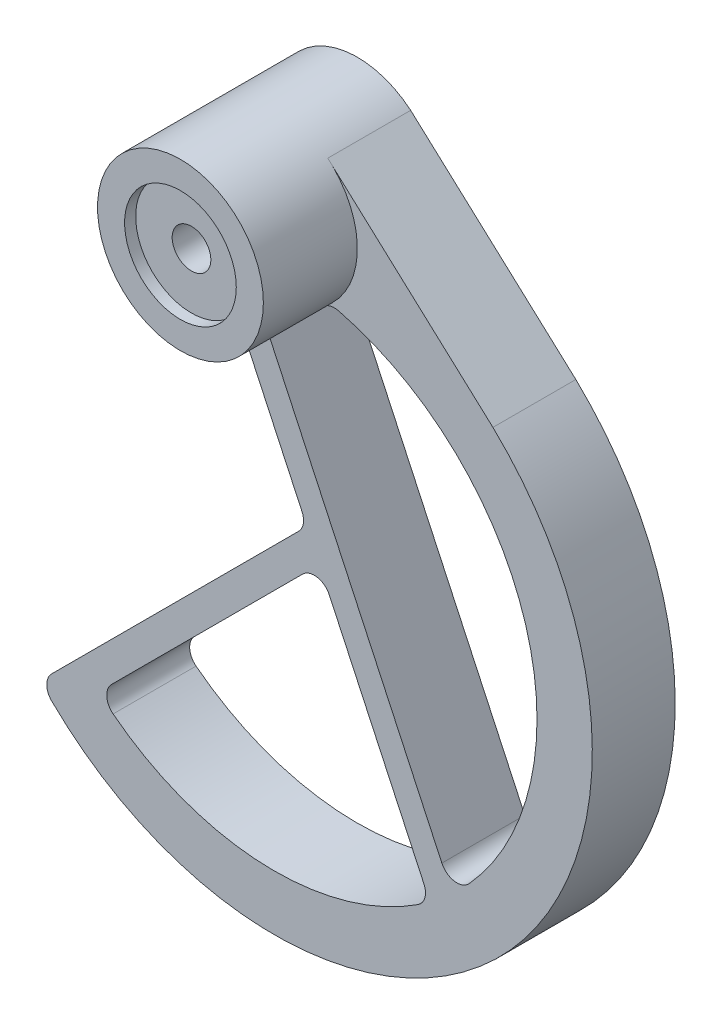
ISO-10303-21;
HEADER;
FILE_DESCRIPTION(('STEP AP214'),'2;1');
FILE_NAME('part.step','',(''),(''),'','','');
FILE_SCHEMA(('AUTOMOTIVE_DESIGN { 1 0 10303 214 1 1 1 1 }'));
ENDSEC;
DATA;
#1=APPLICATION_CONTEXT('core data for automotive mechanical design processes');
#2=APPLICATION_PROTOCOL_DEFINITION('international standard','automotive_design',2000,#1);
#3=PRODUCT_CONTEXT('',#1,'mechanical');
#4=PRODUCT('Part','Part','',(#3));
#5=PRODUCT_RELATED_PRODUCT_CATEGORY('part','',(#4));
#6=PRODUCT_DEFINITION_FORMATION('','',#4);
#7=PRODUCT_DEFINITION_CONTEXT('part definition',#1,'design');
#8=PRODUCT_DEFINITION('design','',#6,#7);
#9=PRODUCT_DEFINITION_SHAPE('','',#8);
#10=(LENGTH_UNIT() NAMED_UNIT(*) SI_UNIT(.MILLI.,.METRE.));
#11=(NAMED_UNIT(*) PLANE_ANGLE_UNIT() SI_UNIT($,.RADIAN.));
#12=(NAMED_UNIT(*) SI_UNIT($,.STERADIAN.) SOLID_ANGLE_UNIT());
#13=UNCERTAINTY_MEASURE_WITH_UNIT(LENGTH_MEASURE(1.E-05),#10,'distance_accuracy_value','');
#14=(GEOMETRIC_REPRESENTATION_CONTEXT(3) GLOBAL_UNCERTAINTY_ASSIGNED_CONTEXT((#13)) GLOBAL_UNIT_ASSIGNED_CONTEXT((#10,
#11,#12)) REPRESENTATION_CONTEXT('',''));
#15=CARTESIAN_POINT('',(0.,0.,0.));
#16=DIRECTION('',(0.,0.,1.));
#17=DIRECTION('',(1.,0.,0.));
#18=AXIS2_PLACEMENT_3D('',#15,#16,#17);
#19=CARTESIAN_POINT('',(0.,57.5,0.));
#20=DIRECTION('',(0.,0.,1.));
#21=DIRECTION('',(1.,0.,0.));
#22=AXIS2_PLACEMENT_3D('',#19,#20,#21);
#23=CYLINDRICAL_SURFACE('',#22,3.5);
#24=CARTESIAN_POINT('',(0.,57.5,0.));
#25=DIRECTION('',(0.,0.,1.));
#26=DIRECTION('',(1.,0.,0.));
#27=AXIS2_PLACEMENT_3D('',#24,#25,#26);
#28=CIRCLE('',#27,3.5);
#29=CARTESIAN_POINT('',(3.5,57.5,0.));
#30=VERTEX_POINT('',#29);
#31=EDGE_CURVE('E253',#30,#30,#28,.T.);
#32=ORIENTED_EDGE('',*,*,#31,.F.);
#33=EDGE_LOOP('',(#32));
#34=FACE_BOUND('',#33,.T.);
#35=CARTESIAN_POINT('',(0.,57.5,30.));
#36=DIRECTION('',(0.,0.,1.));
#37=DIRECTION('',(1.,0.,0.));
#38=AXIS2_PLACEMENT_3D('',#35,#36,#37);
#39=CIRCLE('',#38,3.5);
#40=CARTESIAN_POINT('',(3.5,57.5,30.));
#41=VERTEX_POINT('',#40);
#42=EDGE_CURVE('E37',#41,#41,#39,.F.);
#43=ORIENTED_EDGE('',*,*,#42,.F.);
#44=EDGE_LOOP('',(#43));
#45=FACE_BOUND('',#44,.T.);
#46=ADVANCED_FACE('F33',(#34,#45),#23,.F.);
#47=CARTESIAN_POINT('',(8.4291609341208,3.93058229540153,15.));
#48=DIRECTION('',(0.906307787036647,0.422618261740705,0.));
#49=DIRECTION('',(-0.422618261740705,0.906307787036647,0.));
#50=AXIS2_PLACEMENT_3D('',#47,#48,#49);
#51=PLANE('',#50);
#52=DIRECTION('',(0.422618261740705,-0.906307787036647,0.));
#53=VECTOR('',#52,1.);
#54=CARTESIAN_POINT('',(8.4291609341208,3.93058229540153,0.));
#55=LINE('',#54,#53);
#56=CARTESIAN_POINT('',(-13.5946168055502,51.1607260738895,0.));
#57=VERTEX_POINT('',#56);
#58=CARTESIAN_POINT('',(4.98643209632603,11.3135381134901,0.));
#59=VERTEX_POINT('',#58);
#60=EDGE_CURVE('E346',#57,#59,#55,.T.);
#61=ORIENTED_EDGE('',*,*,#60,.T.);
#62=DIRECTION('',(0.,0.,-1.));
#63=VECTOR('',#62,1.);
#64=CARTESIAN_POINT('',(4.98643209632603,11.3135381134901,15.));
#65=LINE('',#64,#63);
#66=CARTESIAN_POINT('',(4.98643209632603,11.3135381134901,15.));
#67=VERTEX_POINT('',#66);
#68=EDGE_CURVE('E213',#67,#59,#65,.T.);
#69=ORIENTED_EDGE('',*,*,#68,.F.);
#70=DIRECTION('',(0.422618261740705,-0.906307787036647,0.));
#71=VECTOR('',#70,1.);
#72=CARTESIAN_POINT('',(8.4291609341208,3.93058229540153,15.));
#73=LINE('',#72,#71);
#74=CARTESIAN_POINT('',(-13.5946168055502,51.1607260738895,15.));
#75=VERTEX_POINT('',#74);
#76=EDGE_CURVE('E283',#75,#67,#73,.T.);
#77=ORIENTED_EDGE('',*,*,#76,.F.);
#78=DIRECTION('',(0.,0.,-1.));
#79=VECTOR('',#78,1.);
#80=CARTESIAN_POINT('',(-13.5946168055502,51.1607260738895,15.));
#81=LINE('',#80,#79);
#82=EDGE_CURVE('E203',#75,#57,#81,.T.);
#83=ORIENTED_EDGE('',*,*,#82,.T.);
#84=EDGE_LOOP('',(#61,#69,#77,#83));
#85=FACE_BOUND('',#84,.T.);
#86=ADVANCED_FACE('F323',(#85),#51,.F.);
#87=CARTESIAN_POINT('',(2.26750873521609,10.045683328268,15.));
#88=DIRECTION('',(0.,0.,-1.));
#89=DIRECTION('',(-1.,0.,0.));
#90=AXIS2_PLACEMENT_3D('',#87,#88,#89);
#91=CYLINDRICAL_SURFACE('',#90,3.);
#92=CARTESIAN_POINT('',(2.26750873521609,10.045683328268,0.));
#93=DIRECTION('',(0.,0.,1.));
#94=DIRECTION('',(1.,0.,0.));
#95=AXIS2_PLACEMENT_3D('',#92,#93,#94);
#96=CIRCLE('',#95,3.);
#97=CARTESIAN_POINT('',(4.38882907877573,7.92436298470834,0.));
#98=VERTEX_POINT('',#97);
#99=EDGE_CURVE('E329',#59,#98,#96,.F.);
#100=ORIENTED_EDGE('',*,*,#99,.T.);
#101=DIRECTION('',(0.,0.,-1.));
#102=VECTOR('',#101,1.);
#103=CARTESIAN_POINT('',(4.38882907877573,7.92436298470834,15.));
#104=LINE('',#103,#102);
#105=CARTESIAN_POINT('',(4.38882907877573,7.92436298470834,15.));
#106=VERTEX_POINT('',#105);
#107=EDGE_CURVE('E210',#106,#98,#104,.T.);
#108=ORIENTED_EDGE('',*,*,#107,.F.);
#109=CARTESIAN_POINT('',(2.26750873521609,10.045683328268,15.));
#110=DIRECTION('',(0.,0.,1.));
#111=DIRECTION('',(1.,0.,0.));
#112=AXIS2_PLACEMENT_3D('',#109,#110,#111);
#113=CIRCLE('',#112,3.);
#114=EDGE_CURVE('E284',#67,#106,#113,.F.);
#115=ORIENTED_EDGE('',*,*,#114,.F.);
#116=ORIENTED_EDGE('',*,*,#68,.T.);
#117=EDGE_LOOP('',(#100,#108,#115,#116));
#118=FACE_BOUND('',#117,.T.);
#119=ADVANCED_FACE('F328',(#118),#91,.F.);
#120=CARTESIAN_POINT('',(-1.7677669529663,1.76776695296629,15.));
#121=DIRECTION('',(0.707106781186549,-0.707106781186546,0.));
#122=DIRECTION('',(0.707106781186546,0.707106781186549,0.));
#123=AXIS2_PLACEMENT_3D('',#120,#121,#122);
#124=PLANE('',#123);
#125=DIRECTION('',(-0.707106781186546,-0.707106781186549,0.));
#126=VECTOR('',#125,1.);
#127=CARTESIAN_POINT('',(-1.7677669529663,1.76776695296629,0.));
#128=LINE('',#127,#126);
#129=CARTESIAN_POINT('',(-40.3034646889616,-36.7679307830292,0.));
#130=VERTEX_POINT('',#129);
#131=EDGE_CURVE('E333',#98,#130,#128,.T.);
#132=ORIENTED_EDGE('',*,*,#131,.T.);
#133=DIRECTION('',(0.,0.,-1.));
#134=VECTOR('',#133,1.);
#135=CARTESIAN_POINT('',(-40.3034646889616,-36.7679307830292,15.));
#136=LINE('',#135,#134);
#137=CARTESIAN_POINT('',(-40.3034646889616,-36.7679307830292,15.));
#138=VERTEX_POINT('',#137);
#139=EDGE_CURVE('E201',#138,#130,#136,.T.);
#140=ORIENTED_EDGE('',*,*,#139,.F.);
#141=DIRECTION('',(-0.707106781186546,-0.707106781186549,0.));
#142=VECTOR('',#141,1.);
#143=CARTESIAN_POINT('',(-1.7677669529663,1.76776695296629,15.));
#144=LINE('',#143,#142);
#145=EDGE_CURVE('E286',#106,#138,#144,.T.);
#146=ORIENTED_EDGE('',*,*,#145,.F.);
#147=ORIENTED_EDGE('',*,*,#107,.T.);
#148=EDGE_LOOP('',(#132,#140,#146,#147));
#149=FACE_BOUND('',#148,.T.);
#150=ADVANCED_FACE('F332',(#149),#124,.F.);
#151=CARTESIAN_POINT('',(-38.1821443454019,-38.8892511265888,15.));
#152=DIRECTION('',(0.,0.,-1.));
#153=DIRECTION('',(-1.,0.,0.));
#154=AXIS2_PLACEMENT_3D('',#151,#152,#153);
#155=CYLINDRICAL_SURFACE('',#154,3.00000000000001);
#156=CARTESIAN_POINT('',(-38.1821443454019,-38.8892511265888,0.));
#157=DIRECTION('',(0.,0.,1.));
#158=DIRECTION('',(1.,0.,0.));
#159=AXIS2_PLACEMENT_3D('',#156,#157,#158);
#160=CIRCLE('',#159,3.00000000000001);
#161=CARTESIAN_POINT('',(-40.2839137589103,-41.0299438491533,0.));
#162=VERTEX_POINT('',#161);
#163=EDGE_CURVE('E337',#130,#162,#160,.T.);
#164=ORIENTED_EDGE('',*,*,#163,.T.);
#165=DIRECTION('',(0.,0.,-1.));
#166=VECTOR('',#165,1.);
#167=CARTESIAN_POINT('',(-40.2839137589103,-41.0299438491533,15.));
#168=LINE('',#167,#166);
#169=CARTESIAN_POINT('',(-40.2839137589103,-41.0299438491533,15.));
#170=VERTEX_POINT('',#169);
#171=EDGE_CURVE('E199',#170,#162,#168,.T.);
#172=ORIENTED_EDGE('',*,*,#171,.F.);
#173=CARTESIAN_POINT('',(-38.1821443454019,-38.8892511265888,15.));
#174=DIRECTION('',(0.,0.,1.));
#175=DIRECTION('',(1.,0.,0.));
#176=AXIS2_PLACEMENT_3D('',#173,#174,#175);
#177=CIRCLE('',#176,3.00000000000001);
#178=EDGE_CURVE('E190',#138,#170,#177,.T.);
#179=ORIENTED_EDGE('',*,*,#178,.F.);
#180=ORIENTED_EDGE('',*,*,#139,.T.);
#181=EDGE_LOOP('',(#164,#172,#179,#180));
#182=FACE_BOUND('',#181,.T.);
#183=ADVANCED_FACE('F336',(#182),#155,.T.);
#184=CARTESIAN_POINT('',(0.,0.,15.));
#185=DIRECTION('',(0.,0.,-1.));
#186=DIRECTION('',(-1.,0.,0.));
#187=AXIS2_PLACEMENT_3D('',#184,#185,#186);
#188=CYLINDRICAL_SURFACE('',#187,57.5);
#189=CARTESIAN_POINT('',(0.,0.,0.));
#190=DIRECTION('',(0.,0.,1.));
#191=DIRECTION('',(1.,0.,0.));
#192=AXIS2_PLACEMENT_3D('',#189,#190,#191);
#193=CIRCLE('',#192,57.5);
#194=CARTESIAN_POINT('',(39.5241066523143,41.7623633590879,0.));
#195=VERTEX_POINT('',#194);
#196=EDGE_CURVE('E197',#162,#195,#193,.T.);
#197=ORIENTED_EDGE('',*,*,#196,.T.);
#198=DIRECTION('',(0.,0.,-1.));
#199=VECTOR('',#198,1.);
#200=CARTESIAN_POINT('',(39.5241066523143,41.7623633590879,15.));
#201=LINE('',#200,#199);
#202=CARTESIAN_POINT('',(39.5241066523143,41.7623633590879,15.));
#203=VERTEX_POINT('',#202);
#204=EDGE_CURVE('E179',#203,#195,#201,.T.);
#205=ORIENTED_EDGE('',*,*,#204,.F.);
#206=CARTESIAN_POINT('',(0.,0.,15.));
#207=DIRECTION('',(0.,0.,1.));
#208=DIRECTION('',(1.,0.,0.));
#209=AXIS2_PLACEMENT_3D('',#206,#207,#208);
#210=CIRCLE('',#209,57.5);
#211=EDGE_CURVE('E184',#170,#203,#210,.T.);
#212=ORIENTED_EDGE('',*,*,#211,.F.);
#213=ORIENTED_EDGE('',*,*,#171,.T.);
#214=EDGE_LOOP('',(#197,#205,#212,#213));
#215=FACE_BOUND('',#214,.T.);
#216=ADVANCED_FACE('F195',(#215),#188,.T.);
#217=CARTESIAN_POINT('',(38.7204724221989,42.4946229922743,15.));
#218=DIRECTION('',(0.673519927701708,0.739169065227087,0.));
#219=DIRECTION('',(-0.739169065227087,0.673519927701708,0.));
#220=AXIS2_PLACEMENT_3D('',#217,#218,#219);
#221=PLANE('',#220);
#222=DIRECTION('',(0.739169065227087,-0.673519927701708,0.));
#223=VECTOR('',#222,1.);
#224=CARTESIAN_POINT('',(38.7204724221989,42.4946229922743,0.));
#225=LINE('',#224,#223);
#226=CARTESIAN_POINT('',(9.64181414529832,68.990666646785,0.));
#227=VERTEX_POINT('',#226);
#228=EDGE_CURVE('E340',#227,#195,#225,.T.);
#229=ORIENTED_EDGE('',*,*,#228,.F.);
#230=DIRECTION('',(0.,0.,-1.));
#231=VECTOR('',#230,1.);
#232=CARTESIAN_POINT('',(9.64181414529832,68.990666646785,15.));
#233=LINE('',#232,#231);
#234=CARTESIAN_POINT('',(9.64181414529832,68.990666646785,15.));
#235=VERTEX_POINT('',#234);
#236=EDGE_CURVE('E113',#235,#227,#233,.T.);
#237=ORIENTED_EDGE('',*,*,#236,.F.);
#238=DIRECTION('',(0.739169065227087,-0.673519927701708,0.));
#239=VECTOR('',#238,1.);
#240=CARTESIAN_POINT('',(38.7204724221989,42.4946229922743,15.));
#241=LINE('',#240,#239);
#242=CARTESIAN_POINT('',(10.5469447314245,68.1659250340648,15.));
#243=VERTEX_POINT('',#242);
#244=EDGE_CURVE('E182',#235,#243,#241,.T.);
#245=ORIENTED_EDGE('',*,*,#244,.T.);
#246=EDGE_CURVE('E174',#243,#203,#241,.T.);
#247=ORIENTED_EDGE('',*,*,#246,.T.);
#248=ORIENTED_EDGE('',*,*,#204,.T.);
#249=EDGE_LOOP('',(#229,#237,#245,#247,#248));
#250=FACE_BOUND('',#249,.T.);
#251=ADVANCED_FACE('F177',(#250),#221,.T.);
#252=CARTESIAN_POINT('',(1.76776695296647,-1.76776695296644,15.));
#253=DIRECTION('',(0.707106781186552,-0.707106781186543,0.));
#254=DIRECTION('',(0.707106781186543,0.707106781186552,0.));
#255=AXIS2_PLACEMENT_3D('',#252,#253,#254);
#256=PLANE('',#255);
#257=DIRECTION('',(-0.707106781186543,-0.707106781186552,0.));
#258=VECTOR('',#257,1.);
#259=CARTESIAN_POINT('',(1.76776695296647,-1.76776695296644,0.));
#260=LINE('',#259,#258);
#261=CARTESIAN_POINT('',(5.09333895591193,1.55780504997907,0.));
#262=VERTEX_POINT('',#261);
#263=CARTESIAN_POINT('',(-29.4572230390253,-32.9927569449586,0.));
#264=VERTEX_POINT('',#263);
#265=EDGE_CURVE('E363',#262,#264,#260,.T.);
#266=ORIENTED_EDGE('',*,*,#265,.F.);
#267=DIRECTION('',(0.,0.,-1.));
#268=VECTOR('',#267,1.);
#269=CARTESIAN_POINT('',(5.09333895591193,1.55780504997907,15.));
#270=LINE('',#269,#268);
#271=CARTESIAN_POINT('',(5.09333895591193,1.55780504997907,15.));
#272=VERTEX_POINT('',#271);
#273=EDGE_CURVE('E228',#272,#262,#270,.T.);
#274=ORIENTED_EDGE('',*,*,#273,.F.);
#275=DIRECTION('',(-0.707106781186543,-0.707106781186552,0.));
#276=VECTOR('',#275,1.);
#277=CARTESIAN_POINT('',(1.76776695296647,-1.76776695296644,15.));
#278=LINE('',#277,#276);
#279=CARTESIAN_POINT('',(-29.4572230390253,-32.9927569449586,15.));
#280=VERTEX_POINT('',#279);
#281=EDGE_CURVE('E266',#272,#280,#278,.T.);
#282=ORIENTED_EDGE('',*,*,#281,.T.);
#283=DIRECTION('',(0.,0.,-1.));
#284=VECTOR('',#283,1.);
#285=CARTESIAN_POINT('',(-29.4572230390253,-32.9927569449586,15.));
#286=LINE('',#285,#284);
#287=EDGE_CURVE('E216',#280,#264,#286,.T.);
#288=ORIENTED_EDGE('',*,*,#287,.T.);
#289=EDGE_LOOP('',(#266,#274,#282,#288));
#290=FACE_BOUND('',#289,.T.);
#291=ADVANCED_FACE('F420',(#290),#256,.T.);
#292=CARTESIAN_POINT('',(7.21465929947161,-0.56351529358054,15.));
#293=DIRECTION('',(0.,0.,-1.));
#294=DIRECTION('',(-1.,0.,0.));
#295=AXIS2_PLACEMENT_3D('',#292,#293,#294);
#296=CYLINDRICAL_SURFACE('',#295,3.);
#297=CARTESIAN_POINT('',(7.21465929947161,-0.56351529358054,0.));
#298=DIRECTION('',(0.,0.,1.));
#299=DIRECTION('',(1.,0.,0.));
#300=AXIS2_PLACEMENT_3D('',#297,#298,#299);
#301=CIRCLE('',#300,3.);
#302=CARTESIAN_POINT('',(9.93358266058157,0.704339491641551,0.));
#303=VERTEX_POINT('',#302);
#304=EDGE_CURVE('E360',#262,#303,#301,.F.);
#305=ORIENTED_EDGE('',*,*,#304,.T.);
#306=DIRECTION('',(0.,0.,-1.));
#307=VECTOR('',#306,1.);
#308=CARTESIAN_POINT('',(9.93358266058157,0.704339491641551,15.));
#309=LINE('',#308,#307);
#310=CARTESIAN_POINT('',(9.93358266058157,0.704339491641551,15.));
#311=VERTEX_POINT('',#310);
#312=EDGE_CURVE('E225',#311,#303,#309,.T.);
#313=ORIENTED_EDGE('',*,*,#312,.F.);
#314=CARTESIAN_POINT('',(7.21465929947161,-0.56351529358054,15.));
#315=DIRECTION('',(0.,0.,1.));
#316=DIRECTION('',(1.,0.,0.));
#317=AXIS2_PLACEMENT_3D('',#314,#315,#316);
#318=CIRCLE('',#317,3.);
#319=EDGE_CURVE('E269',#272,#311,#318,.F.);
#320=ORIENTED_EDGE('',*,*,#319,.F.);
#321=ORIENTED_EDGE('',*,*,#273,.T.);
#322=EDGE_LOOP('',(#305,#313,#320,#321));
#323=FACE_BOUND('',#322,.T.);
#324=ADVANCED_FACE('F443',(#323),#296,.F.);
#325=CARTESIAN_POINT('',(8.4291609341208,3.93058229540155,15.));
#326=DIRECTION('',(0.906307787036647,0.422618261740706,0.));
#327=DIRECTION('',(-0.422618261740706,0.906307787036647,0.));
#328=AXIS2_PLACEMENT_3D('',#325,#326,#327);
#329=PLANE('',#328);
#330=DIRECTION('',(0.422618261740706,-0.906307787036647,0.));
#331=VECTOR('',#330,1.);
#332=CARTESIAN_POINT('',(8.4291609341208,3.93058229540155,0.));
#333=LINE('',#332,#331);
#334=CARTESIAN_POINT('',(27.0462176339771,-35.9938246369583,0.));
#335=VERTEX_POINT('',#334);
#336=EDGE_CURVE('E357',#303,#335,#333,.T.);
#337=ORIENTED_EDGE('',*,*,#336,.T.);
#338=DIRECTION('',(0.,0.,-1.));
#339=VECTOR('',#338,1.);
#340=CARTESIAN_POINT('',(27.0462176339771,-35.9938246369583,15.));
#341=LINE('',#340,#339);
#342=CARTESIAN_POINT('',(27.0462176339771,-35.9938246369583,15.));
#343=VERTEX_POINT('',#342);
#344=EDGE_CURVE('E222',#343,#335,#341,.T.);
#345=ORIENTED_EDGE('',*,*,#344,.F.);
#346=DIRECTION('',(0.422618261740706,-0.906307787036647,0.));
#347=VECTOR('',#346,1.);
#348=CARTESIAN_POINT('',(8.4291609341208,3.93058229540155,15.));
#349=LINE('',#348,#347);
#350=EDGE_CURVE('E272',#311,#343,#349,.T.);
#351=ORIENTED_EDGE('',*,*,#350,.F.);
#352=ORIENTED_EDGE('',*,*,#312,.T.);
#353=EDGE_LOOP('',(#337,#345,#351,#352));
#354=FACE_BOUND('',#353,.T.);
#355=ADVANCED_FACE('F439',(#354),#329,.F.);
#356=CARTESIAN_POINT('',(24.3272942728671,-37.2616794221804,15.));
#357=DIRECTION('',(0.,0.,-1.));
#358=DIRECTION('',(-1.,0.,0.));
#359=AXIS2_PLACEMENT_3D('',#356,#357,#358);
#360=CYLINDRICAL_SURFACE('',#359,3.);
#361=CARTESIAN_POINT('',(24.3272942728671,-37.2616794221804,0.));
#362=DIRECTION('',(0.,0.,1.));
#363=DIRECTION('',(1.,0.,0.));
#364=AXIS2_PLACEMENT_3D('',#361,#362,#363);
#365=CIRCLE('',#364,3.);
#366=CARTESIAN_POINT('',(25.9673365833975,-39.7737027540128,0.));
#367=VERTEX_POINT('',#366);
#368=EDGE_CURVE('E354',#335,#367,#365,.F.);
#369=ORIENTED_EDGE('',*,*,#368,.T.);
#370=DIRECTION('',(0.,0.,-1.));
#371=VECTOR('',#370,1.);
#372=CARTESIAN_POINT('',(25.9673365833975,-39.7737027540128,15.));
#373=LINE('',#372,#371);
#374=CARTESIAN_POINT('',(25.9673365833975,-39.7737027540128,15.));
#375=VERTEX_POINT('',#374);
#376=EDGE_CURVE('E220',#375,#367,#373,.T.);
#377=ORIENTED_EDGE('',*,*,#376,.F.);
#378=CARTESIAN_POINT('',(24.3272942728671,-37.2616794221804,15.));
#379=DIRECTION('',(0.,0.,1.));
#380=DIRECTION('',(1.,0.,0.));
#381=AXIS2_PLACEMENT_3D('',#378,#379,#380);
#382=CIRCLE('',#381,3.);
#383=EDGE_CURVE('E275',#343,#375,#382,.F.);
#384=ORIENTED_EDGE('',*,*,#383,.F.);
#385=ORIENTED_EDGE('',*,*,#344,.T.);
#386=EDGE_LOOP('',(#369,#377,#384,#385));
#387=FACE_BOUND('',#386,.T.);
#388=ADVANCED_FACE('F435',(#387),#360,.F.);
#389=CARTESIAN_POINT('',(0.,0.,15.));
#390=DIRECTION('',(0.,0.,-1.));
#391=DIRECTION('',(-1.,0.,0.));
#392=AXIS2_PLACEMENT_3D('',#389,#390,#391);
#393=CYLINDRICAL_SURFACE('',#392,47.5000000000002);
#394=CARTESIAN_POINT('',(0.,0.,0.));
#395=DIRECTION('',(0.,0.,1.));
#396=DIRECTION('',(1.,0.,0.));
#397=AXIS2_PLACEMENT_3D('',#394,#395,#396);
#398=CIRCLE('',#397,47.5000000000002);
#399=CARTESIAN_POINT('',(-29.1787725401039,-37.4813184540365,0.));
#400=VERTEX_POINT('',#399);
#401=EDGE_CURVE('E351',#400,#367,#398,.T.);
#402=ORIENTED_EDGE('',*,*,#401,.F.);
#403=DIRECTION('',(0.,0.,-1.));
#404=VECTOR('',#403,1.);
#405=CARTESIAN_POINT('',(-29.1787725401039,-37.4813184540365,15.));
#406=LINE('',#405,#404);
#407=CARTESIAN_POINT('',(-29.1787725401039,-37.4813184540365,15.));
#408=VERTEX_POINT('',#407);
#409=EDGE_CURVE('E218',#408,#400,#406,.T.);
#410=ORIENTED_EDGE('',*,*,#409,.F.);
#411=CARTESIAN_POINT('',(0.,0.,15.));
#412=DIRECTION('',(0.,0.,1.));
#413=DIRECTION('',(1.,0.,0.));
#414=AXIS2_PLACEMENT_3D('',#411,#412,#413);
#415=CIRCLE('',#414,47.5000000000002);
#416=EDGE_CURVE('E277',#408,#375,#415,.T.);
#417=ORIENTED_EDGE('',*,*,#416,.T.);
#418=ORIENTED_EDGE('',*,*,#376,.T.);
#419=EDGE_LOOP('',(#402,#410,#417,#418));
#420=FACE_BOUND('',#419,.T.);
#421=ADVANCED_FACE('F432',(#420),#393,.F.);
#422=CARTESIAN_POINT('',(10.8692173857394,43.1521739130433,15.));
#423=DIRECTION('',(0.,0.,-1.));
#424=DIRECTION('',(-1.,0.,0.));
#425=AXIS2_PLACEMENT_3D('',#422,#423,#424);
#426=CYLINDRICAL_SURFACE('',#425,3.);
#427=CARTESIAN_POINT('',(10.8692173857394,43.1521739130433,0.));
#428=DIRECTION('',(0.,0.,1.));
#429=DIRECTION('',(1.,0.,0.));
#430=AXIS2_PLACEMENT_3D('',#427,#428,#429);
#431=CIRCLE('',#430,3.);
#432=CARTESIAN_POINT('',(11.6019736139915,46.0613092330238,0.));
#433=VERTEX_POINT('',#432);
#434=CARTESIAN_POINT('',(9.05768115478286,45.5434782608694,0.));
#435=VERTEX_POINT('',#434);
#436=EDGE_CURVE('E256',#433,#435,#431,.T.);
#437=ORIENTED_EDGE('',*,*,#436,.F.);
#438=DIRECTION('',(0.,0.,-1.));
#439=VECTOR('',#438,1.);
#440=CARTESIAN_POINT('',(11.6019736139915,46.0613092330238,15.));
#441=LINE('',#440,#439);
#442=CARTESIAN_POINT('',(11.6019736139915,46.0613092330238,15.));
#443=VERTEX_POINT('',#442);
#444=EDGE_CURVE('E124',#443,#433,#441,.T.);
#445=ORIENTED_EDGE('',*,*,#444,.F.);
#446=CARTESIAN_POINT('',(10.8692173857394,43.1521739130433,15.));
#447=DIRECTION('',(0.,0.,1.));
#448=DIRECTION('',(1.,0.,0.));
#449=AXIS2_PLACEMENT_3D('',#446,#447,#448);
#450=CIRCLE('',#449,3.);
#451=CARTESIAN_POINT('',(9.05768115478286,45.5434782608694,15.));
#452=VERTEX_POINT('',#451);
#453=EDGE_CURVE('E261',#443,#452,#450,.T.);
#454=ORIENTED_EDGE('',*,*,#453,.T.);
#455=DIRECTION('',(0.,0.,-1.));
#456=VECTOR('',#455,1.);
#457=CARTESIAN_POINT('',(9.05768115478286,45.5434782608694,15.));
#458=LINE('',#457,#456);
#459=EDGE_CURVE('E292',#452,#435,#458,.T.);
#460=ORIENTED_EDGE('',*,*,#459,.T.);
#461=EDGE_LOOP('',(#437,#445,#454,#460));
#462=FACE_BOUND('',#461,.T.);
#463=ADVANCED_FACE('F35',(#462),#426,.F.);
#464=CARTESIAN_POINT('',(0.,0.,15.));
#465=DIRECTION('',(0.,0.,-1.));
#466=DIRECTION('',(-1.,0.,0.));
#467=AXIS2_PLACEMENT_3D('',#464,#465,#466);
#468=CYLINDRICAL_SURFACE('',#467,47.5);
#469=CARTESIAN_POINT('',(0.,0.,0.));
#470=DIRECTION('',(0.,0.,1.));
#471=DIRECTION('',(1.,0.,0.));
#472=AXIS2_PLACEMENT_3D('',#469,#470,#471);
#473=CIRCLE('',#472,47.5);
#474=CARTESIAN_POINT('',(35.2318363250107,-31.858557863903,0.));
#475=VERTEX_POINT('',#474);
#476=EDGE_CURVE('E372',#475,#433,#473,.T.);
#477=ORIENTED_EDGE('',*,*,#476,.F.);
#478=DIRECTION('',(0.,0.,-1.));
#479=VECTOR('',#478,1.);
#480=CARTESIAN_POINT('',(35.2318363250107,-31.858557863903,15.));
#481=LINE('',#480,#479);
#482=CARTESIAN_POINT('',(35.2318363250107,-31.858557863903,15.));
#483=VERTEX_POINT('',#482);
#484=EDGE_CURVE('E237',#483,#475,#481,.T.);
#485=ORIENTED_EDGE('',*,*,#484,.F.);
#486=CARTESIAN_POINT('',(0.,0.,15.));
#487=DIRECTION('',(0.,0.,1.));
#488=DIRECTION('',(1.,0.,0.));
#489=AXIS2_PLACEMENT_3D('',#486,#487,#488);
#490=CIRCLE('',#489,47.5);
#491=EDGE_CURVE('E257',#483,#443,#490,.T.);
#492=ORIENTED_EDGE('',*,*,#491,.T.);
#493=ORIENTED_EDGE('',*,*,#444,.T.);
#494=EDGE_LOOP('',(#477,#485,#492,#493));
#495=FACE_BOUND('',#494,.T.);
#496=ADVANCED_FACE('F459',(#495),#468,.F.);
#497=CARTESIAN_POINT('',(33.00666771501,-29.846438419867,15.));
#498=DIRECTION('',(0.,0.,-1.));
#499=DIRECTION('',(-1.,0.,0.));
#500=AXIS2_PLACEMENT_3D('',#497,#498,#499);
#501=CYLINDRICAL_SURFACE('',#500,3.);
#502=CARTESIAN_POINT('',(33.00666771501,-29.846438419867,0.));
#503=DIRECTION('',(0.,0.,1.));
#504=DIRECTION('',(1.,0.,0.));
#505=AXIS2_PLACEMENT_3D('',#502,#503,#504);
#506=CIRCLE('',#505,3.);
#507=CARTESIAN_POINT('',(30.2877443539,-31.1142932050891,0.));
#508=VERTEX_POINT('',#507);
#509=EDGE_CURVE('E371',#475,#508,#506,.F.);
#510=ORIENTED_EDGE('',*,*,#509,.T.);
#511=DIRECTION('',(0.,0.,-1.));
#512=VECTOR('',#511,1.);
#513=CARTESIAN_POINT('',(30.2877443539,-31.1142932050891,15.));
#514=LINE('',#513,#512);
#515=CARTESIAN_POINT('',(30.2877443539,-31.1142932050891,15.));
#516=VERTEX_POINT('',#515);
#517=EDGE_CURVE('E233',#516,#508,#514,.T.);
#518=ORIENTED_EDGE('',*,*,#517,.F.);
#519=CARTESIAN_POINT('',(33.00666771501,-29.846438419867,15.));
#520=DIRECTION('',(0.,0.,1.));
#521=DIRECTION('',(1.,0.,0.));
#522=AXIS2_PLACEMENT_3D('',#519,#520,#521);
#523=CIRCLE('',#522,3.);
#524=EDGE_CURVE('E260',#483,#516,#523,.F.);
#525=ORIENTED_EDGE('',*,*,#524,.F.);
#526=ORIENTED_EDGE('',*,*,#484,.T.);
#527=EDGE_LOOP('',(#510,#518,#525,#526));
#528=FACE_BOUND('',#527,.T.);
#529=ADVANCED_FACE('F456',(#528),#501,.F.);
#530=CARTESIAN_POINT('',(12.9606998693037,6.04367360410479,15.));
#531=DIRECTION('',(-0.906307787036651,-0.422618261740698,0.));
#532=DIRECTION('',(0.422618261740698,-0.906307787036651,0.));
#533=AXIS2_PLACEMENT_3D('',#530,#531,#532);
#534=PLANE('',#533);
#535=DIRECTION('',(-0.422618261740698,0.90630778703665,0.));
#536=VECTOR('',#535,1.);
#537=CARTESIAN_POINT('',(12.9606998693037,6.04367360410479,0.));
#538=LINE('',#537,#536);
#539=CARTESIAN_POINT('',(-2.0547468516362,38.2444030117031,0.));
#540=VERTEX_POINT('',#539);
#541=EDGE_CURVE('E369',#508,#540,#538,.T.);
#542=ORIENTED_EDGE('',*,*,#541,.T.);
#543=DIRECTION('',(0.,0.,-1.));
#544=VECTOR('',#543,1.);
#545=CARTESIAN_POINT('',(-2.0547468516362,38.2444030117031,15.));
#546=LINE('',#545,#544);
#547=CARTESIAN_POINT('',(-2.0547468516362,38.2444030117031,15.));
#548=VERTEX_POINT('',#547);
#549=EDGE_CURVE('E230',#548,#540,#546,.T.);
#550=ORIENTED_EDGE('',*,*,#549,.F.);
#551=DIRECTION('',(-0.422618261740698,0.90630778703665,0.));
#552=VECTOR('',#551,1.);
#553=CARTESIAN_POINT('',(12.9606998693037,6.04367360410479,15.));
#554=LINE('',#553,#552);
#555=EDGE_CURVE('E263',#516,#548,#554,.T.);
#556=ORIENTED_EDGE('',*,*,#555,.F.);
#557=ORIENTED_EDGE('',*,*,#517,.T.);
#558=EDGE_LOOP('',(#542,#550,#556,#557));
#559=FACE_BOUND('',#558,.T.);
#560=ADVANCED_FACE('F453',(#559),#534,.F.);
#561=CARTESIAN_POINT('',(0.664176509473749,39.5122577969252,15.));
#562=DIRECTION('',(0.,0.,-1.));
#563=DIRECTION('',(-1.,0.,0.));
#564=AXIS2_PLACEMENT_3D('',#561,#562,#563);
#565=CYLINDRICAL_SURFACE('',#564,3.);
#566=CARTESIAN_POINT('',(0.664176509473749,39.5122577969252,0.));
#567=DIRECTION('',(0.,0.,1.));
#568=DIRECTION('',(1.,0.,0.));
#569=AXIS2_PLACEMENT_3D('',#566,#567,#568);
#570=CIRCLE('',#569,3.);
#571=CARTESIAN_POINT('',(0.553480424561452,42.510214830771,0.));
#572=VERTEX_POINT('',#571);
#573=EDGE_CURVE('E313',#540,#572,#570,.F.);
#574=ORIENTED_EDGE('',*,*,#573,.T.);
#575=DIRECTION('',(0.,0.,-1.));
#576=VECTOR('',#575,1.);
#577=CARTESIAN_POINT('',(0.553480424561452,42.510214830771,15.));
#578=LINE('',#577,#576);
#579=CARTESIAN_POINT('',(0.553480424561452,42.510214830771,15.));
#580=VERTEX_POINT('',#579);
#581=EDGE_CURVE('E234',#580,#572,#578,.T.);
#582=ORIENTED_EDGE('',*,*,#581,.F.);
#583=CARTESIAN_POINT('',(0.664176509473749,39.5122577969252,15.));
#584=DIRECTION('',(0.,0.,1.));
#585=DIRECTION('',(1.,0.,0.));
#586=AXIS2_PLACEMENT_3D('',#583,#584,#585);
#587=CIRCLE('',#586,3.);
#588=EDGE_CURVE('E265',#548,#580,#587,.F.);
#589=ORIENTED_EDGE('',*,*,#588,.F.);
#590=ORIENTED_EDGE('',*,*,#549,.T.);
#591=EDGE_LOOP('',(#574,#582,#589,#590));
#592=FACE_BOUND('',#591,.T.);
#593=ADVANCED_FACE('F311',(#592),#565,.F.);
#594=CARTESIAN_POINT('',(-27.3359026954657,-35.1140772885184,15.));
#595=DIRECTION('',(0.,0.,-1.));
#596=DIRECTION('',(-1.,0.,0.));
#597=AXIS2_PLACEMENT_3D('',#594,#595,#596);
#598=CYLINDRICAL_SURFACE('',#597,3.00000000000001);
#599=CARTESIAN_POINT('',(-27.3359026954657,-35.1140772885184,0.));
#600=DIRECTION('',(0.,0.,1.));
#601=DIRECTION('',(1.,0.,0.));
#602=AXIS2_PLACEMENT_3D('',#599,#600,#601);
#603=CIRCLE('',#602,3.00000000000001);
#604=EDGE_CURVE('E348',#264,#400,#603,.T.);
#605=ORIENTED_EDGE('',*,*,#604,.F.);
#606=ORIENTED_EDGE('',*,*,#287,.F.);
#607=CARTESIAN_POINT('',(-27.3359026954657,-35.1140772885184,15.));
#608=DIRECTION('',(0.,0.,1.));
#609=DIRECTION('',(1.,0.,0.));
#610=AXIS2_PLACEMENT_3D('',#607,#608,#609);
#611=CIRCLE('',#610,3.00000000000001);
#612=EDGE_CURVE('E280',#280,#408,#611,.T.);
#613=ORIENTED_EDGE('',*,*,#612,.T.);
#614=ORIENTED_EDGE('',*,*,#409,.T.);
#615=EDGE_LOOP('',(#605,#606,#613,#614));
#616=FACE_BOUND('',#615,.T.);
#617=ADVANCED_FACE('F417',(#616),#598,.F.);
#618=CARTESIAN_POINT('',(0.,57.5,15.));
#619=DIRECTION('',(0.,0.,-1.));
#620=DIRECTION('',(-1.,0.,0.));
#621=AXIS2_PLACEMENT_3D('',#618,#619,#620);
#622=CYLINDRICAL_SURFACE('',#621,15.0000000000004);
#623=CARTESIAN_POINT('',(0.,57.5,0.));
#624=DIRECTION('',(0.,0.,1.));
#625=DIRECTION('',(1.,0.,0.));
#626=AXIS2_PLACEMENT_3D('',#623,#624,#625);
#627=CIRCLE('',#626,15.0000000000004);
#628=EDGE_CURVE('E116',#227,#57,#627,.T.);
#629=ORIENTED_EDGE('',*,*,#628,.T.);
#630=ORIENTED_EDGE('',*,*,#82,.F.);
#631=CARTESIAN_POINT('',(0.,57.5,15.));
#632=DIRECTION('',(0.,0.,1.));
#633=DIRECTION('',(1.,0.,0.));
#634=AXIS2_PLACEMENT_3D('',#631,#632,#633);
#635=CIRCLE('',#634,15.0000000000004);
#636=EDGE_CURVE('E11',#75,#580,#635,.T.);
#637=ORIENTED_EDGE('',*,*,#636,.T.);
#638=ORIENTED_EDGE('',*,*,#581,.T.);
#639=CARTESIAN_POINT('',(0.,57.5,0.));
#640=DIRECTION('',(0.,0.,1.));
#641=DIRECTION('',(1.,0.,0.));
#642=AXIS2_PLACEMENT_3D('',#639,#640,#641);
#643=CIRCLE('',#642,15.0000000000004);
#644=EDGE_CURVE('E366',#572,#435,#643,.T.);
#645=ORIENTED_EDGE('',*,*,#644,.T.);
#646=ORIENTED_EDGE('',*,*,#459,.F.);
#647=EDGE_CURVE('E43',#452,#243,#635,.T.);
#648=ORIENTED_EDGE('',*,*,#647,.T.);
#649=EDGE_CURVE('E248',#243,#235,#635,.T.);
#650=ORIENTED_EDGE('',*,*,#649,.T.);
#651=ORIENTED_EDGE('',*,*,#236,.T.);
#652=EDGE_LOOP('',(#629,#630,#637,#638,#645,#646,#648,#650,#651));
#653=FACE_BOUND('',#652,.T.);
#654=CARTESIAN_POINT('',(0.,57.5,32.));
#655=DIRECTION('',(0.,0.,1.));
#656=DIRECTION('',(1.,0.,0.));
#657=AXIS2_PLACEMENT_3D('',#654,#655,#656);
#658=CIRCLE('',#657,15.0000000000004);
#659=CARTESIAN_POINT('',(15.0000000000004,57.5,32.));
#660=VERTEX_POINT('',#659);
#661=EDGE_CURVE('E251',#660,#660,#658,.T.);
#662=ORIENTED_EDGE('',*,*,#661,.F.);
#663=EDGE_LOOP('',(#662));
#664=FACE_BOUND('',#663,.T.);
#665=ADVANCED_FACE('F316',(#653,#664),#622,.T.);
#666=CARTESIAN_POINT('',(0.,0.,15.));
#667=DIRECTION('',(0.,0.,1.));
#668=DIRECTION('',(1.,0.,0.));
#669=AXIS2_PLACEMENT_3D('',#666,#667,#668);
#670=PLANE('',#669);
#671=ORIENTED_EDGE('',*,*,#636,.F.);
#672=ORIENTED_EDGE('',*,*,#76,.T.);
#673=ORIENTED_EDGE('',*,*,#114,.T.);
#674=ORIENTED_EDGE('',*,*,#145,.T.);
#675=ORIENTED_EDGE('',*,*,#178,.T.);
#676=ORIENTED_EDGE('',*,*,#211,.T.);
#677=ORIENTED_EDGE('',*,*,#246,.F.);
#678=ORIENTED_EDGE('',*,*,#647,.F.);
#679=ORIENTED_EDGE('',*,*,#453,.F.);
#680=ORIENTED_EDGE('',*,*,#491,.F.);
#681=ORIENTED_EDGE('',*,*,#524,.T.);
#682=ORIENTED_EDGE('',*,*,#555,.T.);
#683=ORIENTED_EDGE('',*,*,#588,.T.);
#684=EDGE_LOOP('',(#671,#672,#673,#674,#675,#676,#677,#678,#679,#680,#681,#682,#683));
#685=FACE_BOUND('',#684,.T.);
#686=ORIENTED_EDGE('',*,*,#281,.F.);
#687=ORIENTED_EDGE('',*,*,#319,.T.);
#688=ORIENTED_EDGE('',*,*,#350,.T.);
#689=ORIENTED_EDGE('',*,*,#383,.T.);
#690=ORIENTED_EDGE('',*,*,#416,.F.);
#691=ORIENTED_EDGE('',*,*,#612,.F.);
#692=EDGE_LOOP('',(#686,#687,#688,#689,#690,#691));
#693=FACE_BOUND('',#692,.T.);
#694=ADVANCED_FACE('F187',(#685,#693),#670,.T.);
#695=CARTESIAN_POINT('',(0.,0.,0.));
#696=DIRECTION('',(0.,0.,1.));
#697=DIRECTION('',(1.,0.,0.));
#698=AXIS2_PLACEMENT_3D('',#695,#696,#697);
#699=PLANE('',#698);
#700=ORIENTED_EDGE('',*,*,#31,.T.);
#701=EDGE_LOOP('',(#700));
#702=FACE_BOUND('',#701,.T.);
#703=ORIENTED_EDGE('',*,*,#436,.T.);
#704=ORIENTED_EDGE('',*,*,#644,.F.);
#705=ORIENTED_EDGE('',*,*,#573,.F.);
#706=ORIENTED_EDGE('',*,*,#541,.F.);
#707=ORIENTED_EDGE('',*,*,#509,.F.);
#708=ORIENTED_EDGE('',*,*,#476,.T.);
#709=EDGE_LOOP('',(#703,#704,#705,#706,#707,#708));
#710=FACE_BOUND('',#709,.T.);
#711=ORIENTED_EDGE('',*,*,#265,.T.);
#712=ORIENTED_EDGE('',*,*,#604,.T.);
#713=ORIENTED_EDGE('',*,*,#401,.T.);
#714=ORIENTED_EDGE('',*,*,#368,.F.);
#715=ORIENTED_EDGE('',*,*,#336,.F.);
#716=ORIENTED_EDGE('',*,*,#304,.F.);
#717=EDGE_LOOP('',(#711,#712,#713,#714,#715,#716));
#718=FACE_BOUND('',#717,.T.);
#719=ORIENTED_EDGE('',*,*,#60,.F.);
#720=ORIENTED_EDGE('',*,*,#628,.F.);
#721=ORIENTED_EDGE('',*,*,#228,.T.);
#722=ORIENTED_EDGE('',*,*,#196,.F.);
#723=ORIENTED_EDGE('',*,*,#163,.F.);
#724=ORIENTED_EDGE('',*,*,#131,.F.);
#725=ORIENTED_EDGE('',*,*,#99,.F.);
#726=EDGE_LOOP('',(#719,#720,#721,#722,#723,#724,#725));
#727=FACE_BOUND('',#726,.T.);
#728=ADVANCED_FACE('F339',(#702,#710,#718,#727),#699,.F.);
#729=CARTESIAN_POINT('',(0.,57.5,32.));
#730=DIRECTION('',(0.,0.,1.));
#731=DIRECTION('',(1.,0.,0.));
#732=AXIS2_PLACEMENT_3D('',#729,#730,#731);
#733=PLANE('',#732);
#734=CARTESIAN_POINT('',(0.,57.5,32.));
#735=DIRECTION('',(0.,0.,1.));
#736=DIRECTION('',(1.,0.,0.));
#737=AXIS2_PLACEMENT_3D('',#734,#735,#736);
#738=CIRCLE('',#737,10.1);
#739=CARTESIAN_POINT('',(10.1,57.5,32.));
#740=VERTEX_POINT('',#739);
#741=EDGE_CURVE('E626',#740,#740,#738,.T.);
#742=ORIENTED_EDGE('',*,*,#741,.F.);
#743=EDGE_LOOP('',(#742));
#744=FACE_BOUND('',#743,.T.);
#745=ORIENTED_EDGE('',*,*,#661,.T.);
#746=EDGE_LOOP('',(#745));
#747=FACE_BOUND('',#746,.T.);
#748=ADVANCED_FACE('F389',(#744,#747),#733,.T.);
#749=CARTESIAN_POINT('',(0.,57.5,15.));
#750=DIRECTION('',(0.,0.,1.));
#751=DIRECTION('',(1.,0.,0.));
#752=AXIS2_PLACEMENT_3D('',#749,#750,#751);
#753=PLANE('',#752);
#754=ORIENTED_EDGE('',*,*,#244,.F.);
#755=ORIENTED_EDGE('',*,*,#649,.F.);
#756=EDGE_LOOP('',(#754,#755));
#757=FACE_BOUND('',#756,.T.);
#758=ADVANCED_FACE('F386',(#757),#753,.F.);
#759=CARTESIAN_POINT('',(0.,57.5,30.));
#760=DIRECTION('',(0.,0.,1.));
#761=DIRECTION('',(1.,0.,0.));
#762=AXIS2_PLACEMENT_3D('',#759,#760,#761);
#763=PLANE('',#762);
#764=CARTESIAN_POINT('',(0.,57.5,30.));
#765=DIRECTION('',(0.,0.,1.));
#766=DIRECTION('',(1.,0.,0.));
#767=AXIS2_PLACEMENT_3D('',#764,#765,#766);
#768=CIRCLE('',#767,10.1);
#769=CARTESIAN_POINT('',(10.1,57.5,30.));
#770=VERTEX_POINT('',#769);
#771=EDGE_CURVE('E623',#770,#770,#768,.T.);
#772=ORIENTED_EDGE('',*,*,#771,.T.);
#773=EDGE_LOOP('',(#772));
#774=FACE_BOUND('',#773,.T.);
#775=ORIENTED_EDGE('',*,*,#42,.T.);
#776=EDGE_LOOP('',(#775));
#777=FACE_BOUND('',#776,.T.);
#778=ADVANCED_FACE('F388',(#774,#777),#763,.T.);
#779=CARTESIAN_POINT('',(0.,57.5,30.));
#780=DIRECTION('',(0.,0.,1.));
#781=DIRECTION('',(1.,0.,0.));
#782=AXIS2_PLACEMENT_3D('',#779,#780,#781);
#783=CYLINDRICAL_SURFACE('',#782,10.1);
#784=ORIENTED_EDGE('',*,*,#771,.F.);
#785=EDGE_LOOP('',(#784));
#786=FACE_BOUND('',#785,.T.);
#787=ORIENTED_EDGE('',*,*,#741,.T.);
#788=EDGE_LOOP('',(#787));
#789=FACE_BOUND('',#788,.T.);
#790=ADVANCED_FACE('F395',(#786,#789),#783,.F.);
#791=CLOSED_SHELL('',(#46,#86,#119,#150,#183,#216,#251,#291,#324,#355,#388,#421,#463,#496,#529,
#560,#593,#617,#665,#694,#728,#748,#758,#778,#790));
#792=MANIFOLD_SOLID_BREP('B2',#791);
#793=ADVANCED_BREP_SHAPE_REPRESENTATION('',(#18,#792),#14);
#794=SHAPE_DEFINITION_REPRESENTATION(#9,#793);
ENDSEC;
END-ISO-10303-21;
